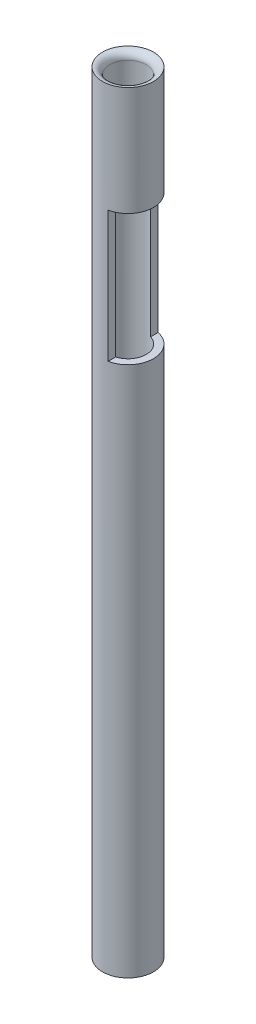
ISO-10303-21;
HEADER;
FILE_DESCRIPTION(('STEP AP214'),'2;1');
FILE_NAME('part.step','',(''),(''),'','','');
FILE_SCHEMA(('AUTOMOTIVE_DESIGN { 1 0 10303 214 1 1 1 1 }'));
ENDSEC;
DATA;
#1=APPLICATION_CONTEXT('core data for automotive mechanical design processes');
#2=APPLICATION_PROTOCOL_DEFINITION('international standard','automotive_design',2000,#1);
#3=PRODUCT_CONTEXT('',#1,'mechanical');
#4=PRODUCT('Part','Part','',(#3));
#5=PRODUCT_RELATED_PRODUCT_CATEGORY('part','',(#4));
#6=PRODUCT_DEFINITION_FORMATION('','',#4);
#7=PRODUCT_DEFINITION_CONTEXT('part definition',#1,'design');
#8=PRODUCT_DEFINITION('design','',#6,#7);
#9=PRODUCT_DEFINITION_SHAPE('','',#8);
#10=(LENGTH_UNIT() NAMED_UNIT(*) SI_UNIT(.MILLI.,.METRE.));
#11=(NAMED_UNIT(*) PLANE_ANGLE_UNIT() SI_UNIT($,.RADIAN.));
#12=(NAMED_UNIT(*) SI_UNIT($,.STERADIAN.) SOLID_ANGLE_UNIT());
#13=UNCERTAINTY_MEASURE_WITH_UNIT(LENGTH_MEASURE(1.E-05),#10,'distance_accuracy_value','');
#14=(GEOMETRIC_REPRESENTATION_CONTEXT(3) GLOBAL_UNCERTAINTY_ASSIGNED_CONTEXT((#13)) GLOBAL_UNIT_ASSIGNED_CONTEXT((#10,
#11,#12)) REPRESENTATION_CONTEXT('',''));
#15=CARTESIAN_POINT('',(0.,0.,0.));
#16=DIRECTION('',(0.,0.,1.));
#17=DIRECTION('',(1.,0.,0.));
#18=AXIS2_PLACEMENT_3D('',#15,#16,#17);
#19=CARTESIAN_POINT('',(3.5,455.,-17.5));
#20=DIRECTION('',(-1.,0.,0.));
#21=DIRECTION('',(0.,-1.,0.));
#22=AXIS2_PLACEMENT_3D('',#19,#20,#21);
#23=PLANE('',#22);
#24=DIRECTION('',(0.,-1.,0.));
#25=VECTOR('',#24,1.);
#26=CARTESIAN_POINT('',(3.5,530.,-12.));
#27=LINE('',#26,#25);
#28=CARTESIAN_POINT('',(3.5,455.,-12.));
#29=VERTEX_POINT('',#28);
#30=CARTESIAN_POINT('',(3.5,365.,-12.));
#31=VERTEX_POINT('',#30);
#32=EDGE_CURVE('E59',#29,#31,#27,.T.);
#33=ORIENTED_EDGE('',*,*,#32,.T.);
#34=DIRECTION('',(0.,0.,-1.));
#35=VECTOR('',#34,1.);
#36=CARTESIAN_POINT('',(3.50000000000001,365.,-17.5));
#37=LINE('',#36,#35);
#38=CARTESIAN_POINT('',(3.5,365.,-17.1464281994822));
#39=VERTEX_POINT('',#38);
#40=EDGE_CURVE('E95',#31,#39,#37,.T.);
#41=ORIENTED_EDGE('',*,*,#40,.T.);
#42=DIRECTION('',(0.,-1.,0.));
#43=VECTOR('',#42,1.);
#44=CARTESIAN_POINT('',(3.5,530.,-17.1464281994823));
#45=LINE('',#44,#43);
#46=CARTESIAN_POINT('',(3.5,455.,-17.1464281994823));
#47=VERTEX_POINT('',#46);
#48=EDGE_CURVE('E62',#47,#39,#45,.T.);
#49=ORIENTED_EDGE('',*,*,#48,.F.);
#50=DIRECTION('',(0.,0.,1.));
#51=VECTOR('',#50,1.);
#52=CARTESIAN_POINT('',(3.5,455.,-17.5));
#53=LINE('',#52,#51);
#54=EDGE_CURVE('E56',#47,#29,#53,.T.);
#55=ORIENTED_EDGE('',*,*,#54,.T.);
#56=EDGE_LOOP('',(#33,#41,#49,#55));
#57=FACE_BOUND('',#56,.T.);
#58=ADVANCED_FACE('F16',(#57),#23,.F.);
#59=CARTESIAN_POINT('',(42.7119216641524,365.,-17.5));
#60=DIRECTION('',(0.,-1.,0.));
#61=DIRECTION('',(0.,0.,-1.));
#62=AXIS2_PLACEMENT_3D('',#59,#60,#61);
#63=PLANE('',#62);
#64=CARTESIAN_POINT('',(0.,365.,0.));
#65=DIRECTION('',(0.,-1.,0.));
#66=DIRECTION('',(0.,0.,-1.));
#67=AXIS2_PLACEMENT_3D('',#64,#65,#66);
#68=CIRCLE('',#67,12.5);
#69=CARTESIAN_POINT('',(3.50000000000001,365.,12.));
#70=VERTEX_POINT('',#69);
#71=EDGE_CURVE('E73',#31,#70,#68,.T.);
#72=ORIENTED_EDGE('',*,*,#71,.T.);
#73=DIRECTION('',(0.,0.,1.));
#74=VECTOR('',#73,1.);
#75=CARTESIAN_POINT('',(3.50000000000001,365.,-17.5));
#76=LINE('',#75,#74);
#77=CARTESIAN_POINT('',(3.50000000000001,365.,17.1464281994822));
#78=VERTEX_POINT('',#77);
#79=EDGE_CURVE('E65',#70,#78,#76,.T.);
#80=ORIENTED_EDGE('',*,*,#79,.T.);
#81=CARTESIAN_POINT('',(0.,365.,0.));
#82=DIRECTION('',(0.,-1.,0.));
#83=DIRECTION('',(0.,0.,-1.));
#84=AXIS2_PLACEMENT_3D('',#81,#82,#83);
#85=CIRCLE('',#84,17.5);
#86=EDGE_CURVE('E86',#39,#78,#85,.T.);
#87=ORIENTED_EDGE('',*,*,#86,.F.);
#88=ORIENTED_EDGE('',*,*,#40,.F.);
#89=EDGE_LOOP('',(#72,#80,#87,#88));
#90=FACE_BOUND('',#89,.T.);
#91=ADVANCED_FACE('F97',(#90),#63,.F.);
#92=CARTESIAN_POINT('',(3.5,455.,-17.5));
#93=DIRECTION('',(-1.,0.,0.));
#94=DIRECTION('',(0.,-1.,0.));
#95=AXIS2_PLACEMENT_3D('',#92,#93,#94);
#96=PLANE('',#95);
#97=DIRECTION('',(0.,-1.,0.));
#98=VECTOR('',#97,1.);
#99=CARTESIAN_POINT('',(3.5,530.,12.));
#100=LINE('',#99,#98);
#101=CARTESIAN_POINT('',(3.5,455.,12.));
#102=VERTEX_POINT('',#101);
#103=EDGE_CURVE('E52',#70,#102,#100,.F.);
#104=ORIENTED_EDGE('',*,*,#103,.T.);
#105=DIRECTION('',(0.,0.,1.));
#106=VECTOR('',#105,1.);
#107=CARTESIAN_POINT('',(3.5,455.,-17.5));
#108=LINE('',#107,#106);
#109=CARTESIAN_POINT('',(3.5,455.,17.1464281994823));
#110=VERTEX_POINT('',#109);
#111=EDGE_CURVE('E34',#102,#110,#108,.T.);
#112=ORIENTED_EDGE('',*,*,#111,.T.);
#113=DIRECTION('',(0.,-1.,0.));
#114=VECTOR('',#113,1.);
#115=CARTESIAN_POINT('',(3.5,530.,17.1464281994823));
#116=LINE('',#115,#114);
#117=EDGE_CURVE('E85',#78,#110,#116,.F.);
#118=ORIENTED_EDGE('',*,*,#117,.F.);
#119=ORIENTED_EDGE('',*,*,#79,.F.);
#120=EDGE_LOOP('',(#104,#112,#118,#119));
#121=FACE_BOUND('',#120,.T.);
#122=ADVANCED_FACE('F98',(#121),#96,.F.);
#123=CARTESIAN_POINT('',(42.7119216641524,455.,-17.5));
#124=DIRECTION('',(0.,1.,0.));
#125=DIRECTION('',(0.,0.,1.));
#126=AXIS2_PLACEMENT_3D('',#123,#124,#125);
#127=PLANE('',#126);
#128=CARTESIAN_POINT('',(0.,455.,0.));
#129=DIRECTION('',(0.,-1.,0.));
#130=DIRECTION('',(0.,0.,-1.));
#131=AXIS2_PLACEMENT_3D('',#128,#129,#130);
#132=CIRCLE('',#131,12.5);
#133=EDGE_CURVE('E19',#102,#29,#132,.F.);
#134=ORIENTED_EDGE('',*,*,#133,.T.);
#135=ORIENTED_EDGE('',*,*,#54,.F.);
#136=CARTESIAN_POINT('',(0.,455.,0.));
#137=DIRECTION('',(0.,-1.,0.));
#138=DIRECTION('',(0.,0.,-1.));
#139=AXIS2_PLACEMENT_3D('',#136,#137,#138);
#140=CIRCLE('',#139,17.5);
#141=EDGE_CURVE('E83',#110,#47,#140,.F.);
#142=ORIENTED_EDGE('',*,*,#141,.F.);
#143=ORIENTED_EDGE('',*,*,#111,.F.);
#144=EDGE_LOOP('',(#134,#135,#142,#143));
#145=FACE_BOUND('',#144,.T.);
#146=ADVANCED_FACE('F68',(#145),#127,.F.);
#147=CARTESIAN_POINT('',(0.,530.,0.));
#148=DIRECTION('',(0.,-1.,0.));
#149=DIRECTION('',(0.,0.,-1.));
#150=AXIS2_PLACEMENT_3D('',#147,#148,#149);
#151=CYLINDRICAL_SURFACE('',#150,12.5);
#152=CARTESIAN_POINT('',(0.,0.,0.));
#153=DIRECTION('',(0.,-1.,0.));
#154=DIRECTION('',(0.,0.,-1.));
#155=AXIS2_PLACEMENT_3D('',#152,#153,#154);
#156=CIRCLE('',#155,12.5);
#157=CARTESIAN_POINT('',(0.,0.,-12.5));
#158=VERTEX_POINT('',#157);
#159=EDGE_CURVE('E80',#158,#158,#156,.T.);
#160=ORIENTED_EDGE('',*,*,#159,.T.);
#161=EDGE_LOOP('',(#160));
#162=FACE_BOUND('',#161,.T.);
#163=CARTESIAN_POINT('',(0.,525.,0.));
#164=DIRECTION('',(0.,1.,0.));
#165=DIRECTION('',(0.,0.,1.));
#166=AXIS2_PLACEMENT_3D('',#163,#164,#165);
#167=CIRCLE('',#166,12.5);
#168=CARTESIAN_POINT('',(0.,525.,12.5));
#169=VERTEX_POINT('',#168);
#170=EDGE_CURVE('E75',#169,#169,#167,.F.);
#171=ORIENTED_EDGE('',*,*,#170,.F.);
#172=EDGE_LOOP('',(#171));
#173=FACE_BOUND('',#172,.T.);
#174=ORIENTED_EDGE('',*,*,#32,.F.);
#175=ORIENTED_EDGE('',*,*,#133,.F.);
#176=ORIENTED_EDGE('',*,*,#103,.F.);
#177=ORIENTED_EDGE('',*,*,#71,.F.);
#178=EDGE_LOOP('',(#174,#175,#176,#177));
#179=FACE_BOUND('',#178,.T.);
#180=ADVANCED_FACE('F71',(#162,#173,#179),#151,.F.);
#181=CARTESIAN_POINT('',(0.,525.,0.));
#182=DIRECTION('',(0.,1.,0.));
#183=DIRECTION('',(0.,0.,1.));
#184=AXIS2_PLACEMENT_3D('',#181,#182,#183);
#185=TOROIDAL_SURFACE('',#184,17.5,5.);
#186=CARTESIAN_POINT('',(0.,530.,0.));
#187=DIRECTION('',(0.,-1.,0.));
#188=DIRECTION('',(0.,0.,-1.));
#189=AXIS2_PLACEMENT_3D('',#186,#187,#188);
#190=CIRCLE('',#189,17.5);
#191=CARTESIAN_POINT('',(0.,530.,-17.5));
#192=VERTEX_POINT('',#191);
#193=EDGE_CURVE('E25',#192,#192,#190,.T.);
#194=ORIENTED_EDGE('',*,*,#193,.F.);
#195=EDGE_LOOP('',(#194));
#196=FACE_BOUND('',#195,.T.);
#197=ORIENTED_EDGE('',*,*,#170,.T.);
#198=EDGE_LOOP('',(#197));
#199=FACE_BOUND('',#198,.T.);
#200=ADVANCED_FACE('F109',(#196,#199),#185,.T.);
#201=CARTESIAN_POINT('',(0.,0.,0.));
#202=DIRECTION('',(0.,1.,0.));
#203=DIRECTION('',(0.,0.,1.));
#204=AXIS2_PLACEMENT_3D('',#201,#202,#203);
#205=PLANE('',#204);
#206=ORIENTED_EDGE('',*,*,#159,.F.);
#207=EDGE_LOOP('',(#206));
#208=FACE_BOUND('',#207,.T.);
#209=CARTESIAN_POINT('',(0.,0.,0.));
#210=DIRECTION('',(0.,-1.,0.));
#211=DIRECTION('',(0.,0.,-1.));
#212=AXIS2_PLACEMENT_3D('',#209,#210,#211);
#213=CIRCLE('',#212,17.5);
#214=CARTESIAN_POINT('',(0.,0.,-17.5));
#215=VERTEX_POINT('',#214);
#216=EDGE_CURVE('E11',#215,#215,#213,.F.);
#217=ORIENTED_EDGE('',*,*,#216,.F.);
#218=EDGE_LOOP('',(#217));
#219=FACE_BOUND('',#218,.T.);
#220=ADVANCED_FACE('F101',(#208,#219),#205,.F.);
#221=CARTESIAN_POINT('',(0.,530.,0.));
#222=DIRECTION('',(0.,-1.,0.));
#223=DIRECTION('',(0.,0.,-1.));
#224=AXIS2_PLACEMENT_3D('',#221,#222,#223);
#225=CYLINDRICAL_SURFACE('',#224,17.5);
#226=ORIENTED_EDGE('',*,*,#193,.T.);
#227=EDGE_LOOP('',(#226));
#228=FACE_BOUND('',#227,.T.);
#229=ORIENTED_EDGE('',*,*,#216,.T.);
#230=EDGE_LOOP('',(#229));
#231=FACE_BOUND('',#230,.T.);
#232=ORIENTED_EDGE('',*,*,#117,.T.);
#233=ORIENTED_EDGE('',*,*,#141,.T.);
#234=ORIENTED_EDGE('',*,*,#48,.T.);
#235=ORIENTED_EDGE('',*,*,#86,.T.);
#236=EDGE_LOOP('',(#232,#233,#234,#235));
#237=FACE_BOUND('',#236,.T.);
#238=ADVANCED_FACE('F99',(#228,#231,#237),#225,.T.);
#239=CLOSED_SHELL('',(#58,#91,#122,#146,#180,#200,#220,#238));
#240=MANIFOLD_SOLID_BREP('B1',#239);
#241=ADVANCED_BREP_SHAPE_REPRESENTATION('',(#18,#240),#14);
#242=SHAPE_DEFINITION_REPRESENTATION(#9,#241);
ENDSEC;
END-ISO-10303-21;
